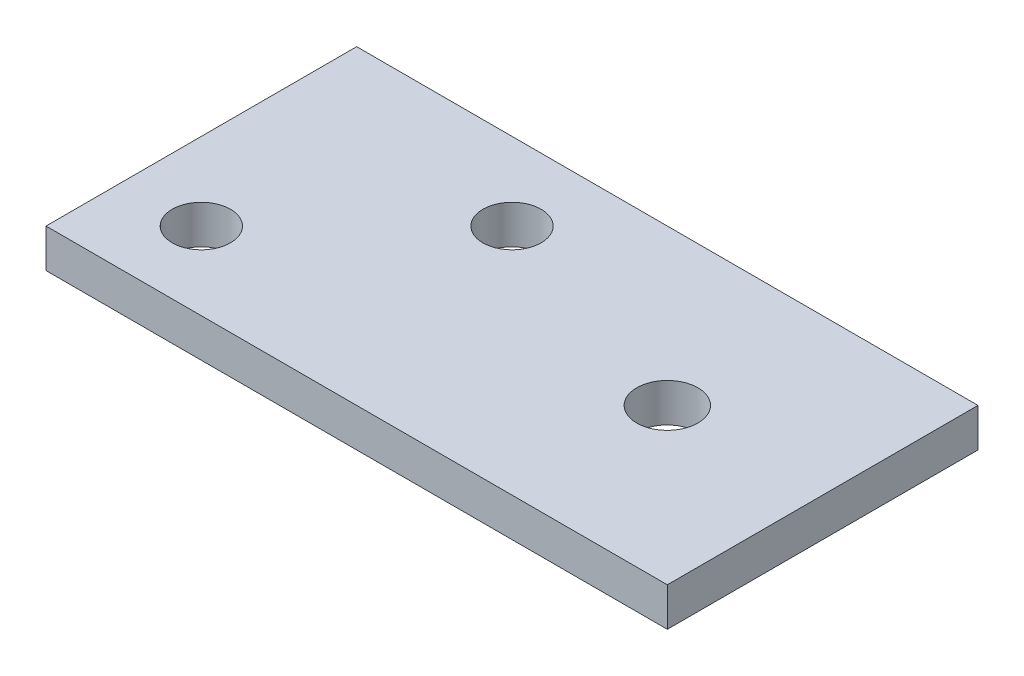
ISO-10303-21;
HEADER;
FILE_DESCRIPTION(('STEP AP214'),'2;1');
FILE_NAME('part.step','',(''),(''),'','','');
FILE_SCHEMA(('AUTOMOTIVE_DESIGN { 1 0 10303 214 1 1 1 1 }'));
ENDSEC;
DATA;
#1=APPLICATION_CONTEXT('core data for automotive mechanical design processes');
#2=APPLICATION_PROTOCOL_DEFINITION('international standard','automotive_design',2000,#1);
#3=PRODUCT_CONTEXT('',#1,'mechanical');
#4=PRODUCT('Part','Part','',(#3));
#5=PRODUCT_RELATED_PRODUCT_CATEGORY('part','',(#4));
#6=PRODUCT_DEFINITION_FORMATION('','',#4);
#7=PRODUCT_DEFINITION_CONTEXT('part definition',#1,'design');
#8=PRODUCT_DEFINITION('design','',#6,#7);
#9=PRODUCT_DEFINITION_SHAPE('','',#8);
#10=(LENGTH_UNIT() NAMED_UNIT(*) SI_UNIT(.MILLI.,.METRE.));
#11=(NAMED_UNIT(*) PLANE_ANGLE_UNIT() SI_UNIT($,.RADIAN.));
#12=(NAMED_UNIT(*) SI_UNIT($,.STERADIAN.) SOLID_ANGLE_UNIT());
#13=UNCERTAINTY_MEASURE_WITH_UNIT(LENGTH_MEASURE(1.E-05),#10,'distance_accuracy_value','');
#14=(GEOMETRIC_REPRESENTATION_CONTEXT(3) GLOBAL_UNCERTAINTY_ASSIGNED_CONTEXT((#13)) GLOBAL_UNIT_ASSIGNED_CONTEXT((#10,
#11,#12)) REPRESENTATION_CONTEXT('',''));
#15=CARTESIAN_POINT('',(0.,0.,0.));
#16=DIRECTION('',(0.,0.,1.));
#17=DIRECTION('',(1.,0.,0.));
#18=AXIS2_PLACEMENT_3D('',#15,#16,#17);
#19=CARTESIAN_POINT('',(50.8,6.31,-25.4));
#20=DIRECTION('',(-1.,0.,0.));
#21=DIRECTION('',(0.,0.,1.));
#22=AXIS2_PLACEMENT_3D('',#19,#20,#21);
#23=PLANE('',#22);
#24=DIRECTION('',(0.,0.,-1.));
#25=VECTOR('',#24,1.);
#26=CARTESIAN_POINT('',(50.8,0.,-25.4));
#27=LINE('',#26,#25);
#28=CARTESIAN_POINT('',(50.8,0.,25.4));
#29=VERTEX_POINT('',#28);
#30=CARTESIAN_POINT('',(50.8,0.,-25.4));
#31=VERTEX_POINT('',#30);
#32=EDGE_CURVE('E97',#29,#31,#27,.T.);
#33=ORIENTED_EDGE('',*,*,#32,.T.);
#34=DIRECTION('',(0.,-1.,0.));
#35=VECTOR('',#34,1.);
#36=CARTESIAN_POINT('',(50.8,6.31,-25.4));
#37=LINE('',#36,#35);
#38=CARTESIAN_POINT('',(50.8,6.31,-25.4));
#39=VERTEX_POINT('',#38);
#40=EDGE_CURVE('E11',#39,#31,#37,.T.);
#41=ORIENTED_EDGE('',*,*,#40,.F.);
#42=DIRECTION('',(0.,0.,-1.));
#43=VECTOR('',#42,1.);
#44=CARTESIAN_POINT('',(50.8,6.31,-25.4));
#45=LINE('',#44,#43);
#46=CARTESIAN_POINT('',(50.8,6.31,25.4));
#47=VERTEX_POINT('',#46);
#48=EDGE_CURVE('E84',#47,#39,#45,.T.);
#49=ORIENTED_EDGE('',*,*,#48,.F.);
#50=DIRECTION('',(0.,-1.,0.));
#51=VECTOR('',#50,1.);
#52=CARTESIAN_POINT('',(50.8,6.31,25.4));
#53=LINE('',#52,#51);
#54=EDGE_CURVE('E93',#47,#29,#53,.T.);
#55=ORIENTED_EDGE('',*,*,#54,.T.);
#56=EDGE_LOOP('',(#33,#41,#49,#55));
#57=FACE_BOUND('',#56,.T.);
#58=ADVANCED_FACE('F32',(#57),#23,.F.);
#59=CARTESIAN_POINT('',(-50.8,6.31,-25.4));
#60=DIRECTION('',(0.,0.,1.));
#61=DIRECTION('',(1.,0.,0.));
#62=AXIS2_PLACEMENT_3D('',#59,#60,#61);
#63=PLANE('',#62);
#64=DIRECTION('',(-1.,0.,0.));
#65=VECTOR('',#64,1.);
#66=CARTESIAN_POINT('',(-50.8,0.,-25.4));
#67=LINE('',#66,#65);
#68=CARTESIAN_POINT('',(-50.8,0.,-25.4));
#69=VERTEX_POINT('',#68);
#70=EDGE_CURVE('E88',#31,#69,#67,.T.);
#71=ORIENTED_EDGE('',*,*,#70,.T.);
#72=DIRECTION('',(0.,-1.,0.));
#73=VECTOR('',#72,1.);
#74=CARTESIAN_POINT('',(-50.8,6.31,-25.4));
#75=LINE('',#74,#73);
#76=CARTESIAN_POINT('',(-50.8,6.31,-25.4));
#77=VERTEX_POINT('',#76);
#78=EDGE_CURVE('E41',#77,#69,#75,.T.);
#79=ORIENTED_EDGE('',*,*,#78,.F.);
#80=DIRECTION('',(-1.,0.,0.));
#81=VECTOR('',#80,1.);
#82=CARTESIAN_POINT('',(-50.8,6.31,-25.4));
#83=LINE('',#82,#81);
#84=EDGE_CURVE('E79',#39,#77,#83,.T.);
#85=ORIENTED_EDGE('',*,*,#84,.F.);
#86=ORIENTED_EDGE('',*,*,#40,.T.);
#87=EDGE_LOOP('',(#71,#79,#85,#86));
#88=FACE_BOUND('',#87,.T.);
#89=ADVANCED_FACE('F87',(#88),#63,.F.);
#90=CARTESIAN_POINT('',(-50.8,6.31,-25.4));
#91=DIRECTION('',(1.,0.,0.));
#92=DIRECTION('',(0.,0.,-1.));
#93=AXIS2_PLACEMENT_3D('',#90,#91,#92);
#94=PLANE('',#93);
#95=DIRECTION('',(0.,0.,1.));
#96=VECTOR('',#95,1.);
#97=CARTESIAN_POINT('',(-50.8,0.,-25.4));
#98=LINE('',#97,#96);
#99=CARTESIAN_POINT('',(-50.8,0.,25.4));
#100=VERTEX_POINT('',#99);
#101=EDGE_CURVE('E66',#69,#100,#98,.T.);
#102=ORIENTED_EDGE('',*,*,#101,.T.);
#103=DIRECTION('',(0.,-1.,0.));
#104=VECTOR('',#103,1.);
#105=CARTESIAN_POINT('',(-50.8,6.31,25.4));
#106=LINE('',#105,#104);
#107=CARTESIAN_POINT('',(-50.8,6.31,25.4));
#108=VERTEX_POINT('',#107);
#109=EDGE_CURVE('E89',#108,#100,#106,.T.);
#110=ORIENTED_EDGE('',*,*,#109,.F.);
#111=DIRECTION('',(0.,0.,1.));
#112=VECTOR('',#111,1.);
#113=CARTESIAN_POINT('',(-50.8,6.31,-25.4));
#114=LINE('',#113,#112);
#115=EDGE_CURVE('E82',#77,#108,#114,.T.);
#116=ORIENTED_EDGE('',*,*,#115,.F.);
#117=ORIENTED_EDGE('',*,*,#78,.T.);
#118=EDGE_LOOP('',(#102,#110,#116,#117));
#119=FACE_BOUND('',#118,.T.);
#120=ADVANCED_FACE('F91',(#119),#94,.F.);
#121=CARTESIAN_POINT('',(-50.8,6.31,25.4));
#122=DIRECTION('',(0.,0.,-1.));
#123=DIRECTION('',(-1.,0.,0.));
#124=AXIS2_PLACEMENT_3D('',#121,#122,#123);
#125=PLANE('',#124);
#126=DIRECTION('',(1.,0.,0.));
#127=VECTOR('',#126,1.);
#128=CARTESIAN_POINT('',(-50.8,0.,25.4));
#129=LINE('',#128,#127);
#130=EDGE_CURVE('E72',#100,#29,#129,.T.);
#131=ORIENTED_EDGE('',*,*,#130,.T.);
#132=ORIENTED_EDGE('',*,*,#54,.F.);
#133=DIRECTION('',(1.,0.,0.));
#134=VECTOR('',#133,1.);
#135=CARTESIAN_POINT('',(-50.8,6.31,25.4));
#136=LINE('',#135,#134);
#137=EDGE_CURVE('E49',#108,#47,#136,.T.);
#138=ORIENTED_EDGE('',*,*,#137,.F.);
#139=ORIENTED_EDGE('',*,*,#109,.T.);
#140=EDGE_LOOP('',(#131,#132,#138,#139));
#141=FACE_BOUND('',#140,.T.);
#142=ADVANCED_FACE('F105',(#141),#125,.F.);
#143=CARTESIAN_POINT('',(0.,6.31,0.));
#144=DIRECTION('',(0.,1.,0.));
#145=DIRECTION('',(0.,0.,1.));
#146=AXIS2_PLACEMENT_3D('',#143,#144,#145);
#147=PLANE('',#146);
#148=CARTESIAN_POINT('',(25.4000000000216,6.31,4.44089209850063E-12));
#149=DIRECTION('',(0.,1.,0.));
#150=DIRECTION('',(0.,0.,1.));
#151=AXIS2_PLACEMENT_3D('',#148,#149,#150);
#152=CIRCLE('',#151,5.);
#153=CARTESIAN_POINT('',(25.4000000000216,6.31,5.00000000000444));
#154=VERTEX_POINT('',#153);
#155=EDGE_CURVE('E122',#154,#154,#152,.T.);
#156=ORIENTED_EDGE('',*,*,#155,.F.);
#157=EDGE_LOOP('',(#156));
#158=FACE_BOUND('',#157,.T.);
#159=CARTESIAN_POINT('',(-12.7,6.31,-12.7));
#160=DIRECTION('',(0.,1.,0.));
#161=DIRECTION('',(0.,0.,1.));
#162=AXIS2_PLACEMENT_3D('',#159,#160,#161);
#163=CIRCLE('',#162,4.7625);
#164=CARTESIAN_POINT('',(-12.7,6.31,-7.9375));
#165=VERTEX_POINT('',#164);
#166=EDGE_CURVE('E117',#165,#165,#163,.T.);
#167=ORIENTED_EDGE('',*,*,#166,.F.);
#168=EDGE_LOOP('',(#167));
#169=FACE_BOUND('',#168,.T.);
#170=CARTESIAN_POINT('',(-38.1,6.31,12.7));
#171=DIRECTION('',(0.,1.,0.));
#172=DIRECTION('',(0.,0.,1.));
#173=AXIS2_PLACEMENT_3D('',#170,#171,#172);
#174=CIRCLE('',#173,4.7625);
#175=CARTESIAN_POINT('',(-38.1,6.31,17.4625));
#176=VERTEX_POINT('',#175);
#177=EDGE_CURVE('E111',#176,#176,#174,.T.);
#178=ORIENTED_EDGE('',*,*,#177,.F.);
#179=EDGE_LOOP('',(#178));
#180=FACE_BOUND('',#179,.T.);
#181=ORIENTED_EDGE('',*,*,#48,.T.);
#182=ORIENTED_EDGE('',*,*,#84,.T.);
#183=ORIENTED_EDGE('',*,*,#115,.T.);
#184=ORIENTED_EDGE('',*,*,#137,.T.);
#185=EDGE_LOOP('',(#181,#182,#183,#184));
#186=FACE_BOUND('',#185,.T.);
#187=ADVANCED_FACE('F80',(#158,#169,#180,#186),#147,.T.);
#188=CARTESIAN_POINT('',(0.,0.,0.));
#189=DIRECTION('',(0.,1.,0.));
#190=DIRECTION('',(0.,0.,1.));
#191=AXIS2_PLACEMENT_3D('',#188,#189,#190);
#192=PLANE('',#191);
#193=CARTESIAN_POINT('',(25.4000000000216,0.,4.44089209850063E-12));
#194=DIRECTION('',(0.,1.,0.));
#195=DIRECTION('',(0.,0.,1.));
#196=AXIS2_PLACEMENT_3D('',#193,#194,#195);
#197=CIRCLE('',#196,5.);
#198=CARTESIAN_POINT('',(25.4000000000216,0.,5.00000000000444));
#199=VERTEX_POINT('',#198);
#200=EDGE_CURVE('E35',#199,#199,#197,.T.);
#201=ORIENTED_EDGE('',*,*,#200,.T.);
#202=EDGE_LOOP('',(#201));
#203=FACE_BOUND('',#202,.T.);
#204=CARTESIAN_POINT('',(-12.7,0.,-12.7));
#205=DIRECTION('',(0.,1.,0.));
#206=DIRECTION('',(0.,0.,1.));
#207=AXIS2_PLACEMENT_3D('',#204,#205,#206);
#208=CIRCLE('',#207,4.7625);
#209=CARTESIAN_POINT('',(-12.7,0.,-7.9375));
#210=VERTEX_POINT('',#209);
#211=EDGE_CURVE('E114',#210,#210,#208,.T.);
#212=ORIENTED_EDGE('',*,*,#211,.T.);
#213=EDGE_LOOP('',(#212));
#214=FACE_BOUND('',#213,.T.);
#215=CARTESIAN_POINT('',(-38.1,0.,12.7));
#216=DIRECTION('',(0.,1.,0.));
#217=DIRECTION('',(0.,0.,1.));
#218=AXIS2_PLACEMENT_3D('',#215,#216,#217);
#219=CIRCLE('',#218,4.7625);
#220=CARTESIAN_POINT('',(-38.1,0.,17.4625));
#221=VERTEX_POINT('',#220);
#222=EDGE_CURVE('E100',#221,#221,#219,.T.);
#223=ORIENTED_EDGE('',*,*,#222,.T.);
#224=EDGE_LOOP('',(#223));
#225=FACE_BOUND('',#224,.T.);
#226=ORIENTED_EDGE('',*,*,#32,.F.);
#227=ORIENTED_EDGE('',*,*,#130,.F.);
#228=ORIENTED_EDGE('',*,*,#101,.F.);
#229=ORIENTED_EDGE('',*,*,#70,.F.);
#230=EDGE_LOOP('',(#226,#227,#228,#229));
#231=FACE_BOUND('',#230,.T.);
#232=ADVANCED_FACE('F108',(#203,#214,#225,#231),#192,.F.);
#233=CARTESIAN_POINT('',(-38.1,0.,12.7));
#234=DIRECTION('',(0.,1.,0.));
#235=DIRECTION('',(0.,0.,1.));
#236=AXIS2_PLACEMENT_3D('',#233,#234,#235);
#237=CYLINDRICAL_SURFACE('',#236,4.7625);
#238=ORIENTED_EDGE('',*,*,#222,.F.);
#239=EDGE_LOOP('',(#238));
#240=FACE_BOUND('',#239,.T.);
#241=ORIENTED_EDGE('',*,*,#177,.T.);
#242=EDGE_LOOP('',(#241));
#243=FACE_BOUND('',#242,.T.);
#244=ADVANCED_FACE('F138',(#240,#243),#237,.F.);
#245=CARTESIAN_POINT('',(-12.7,0.,-12.7));
#246=DIRECTION('',(0.,1.,0.));
#247=DIRECTION('',(0.,0.,1.));
#248=AXIS2_PLACEMENT_3D('',#245,#246,#247);
#249=CYLINDRICAL_SURFACE('',#248,4.7625);
#250=ORIENTED_EDGE('',*,*,#211,.F.);
#251=EDGE_LOOP('',(#250));
#252=FACE_BOUND('',#251,.T.);
#253=ORIENTED_EDGE('',*,*,#166,.T.);
#254=EDGE_LOOP('',(#253));
#255=FACE_BOUND('',#254,.T.);
#256=ADVANCED_FACE('F133',(#252,#255),#249,.F.);
#257=CARTESIAN_POINT('',(25.4000000000216,-3.69,4.44089209850063E-12));
#258=DIRECTION('',(0.,1.,0.));
#259=DIRECTION('',(0.,0.,1.));
#260=AXIS2_PLACEMENT_3D('',#257,#258,#259);
#261=CYLINDRICAL_SURFACE('',#260,5.);
#262=ORIENTED_EDGE('',*,*,#155,.T.);
#263=EDGE_LOOP('',(#262));
#264=FACE_BOUND('',#263,.T.);
#265=ORIENTED_EDGE('',*,*,#200,.F.);
#266=EDGE_LOOP('',(#265));
#267=FACE_BOUND('',#266,.T.);
#268=ADVANCED_FACE('F131',(#264,#267),#261,.F.);
#269=CLOSED_SHELL('',(#58,#89,#120,#142,#187,#232,#244,#256,#268));
#270=MANIFOLD_SOLID_BREP('B2',#269);
#271=ADVANCED_BREP_SHAPE_REPRESENTATION('',(#18,#270),#14);
#272=SHAPE_DEFINITION_REPRESENTATION(#9,#271);
ENDSEC;
END-ISO-10303-21;
